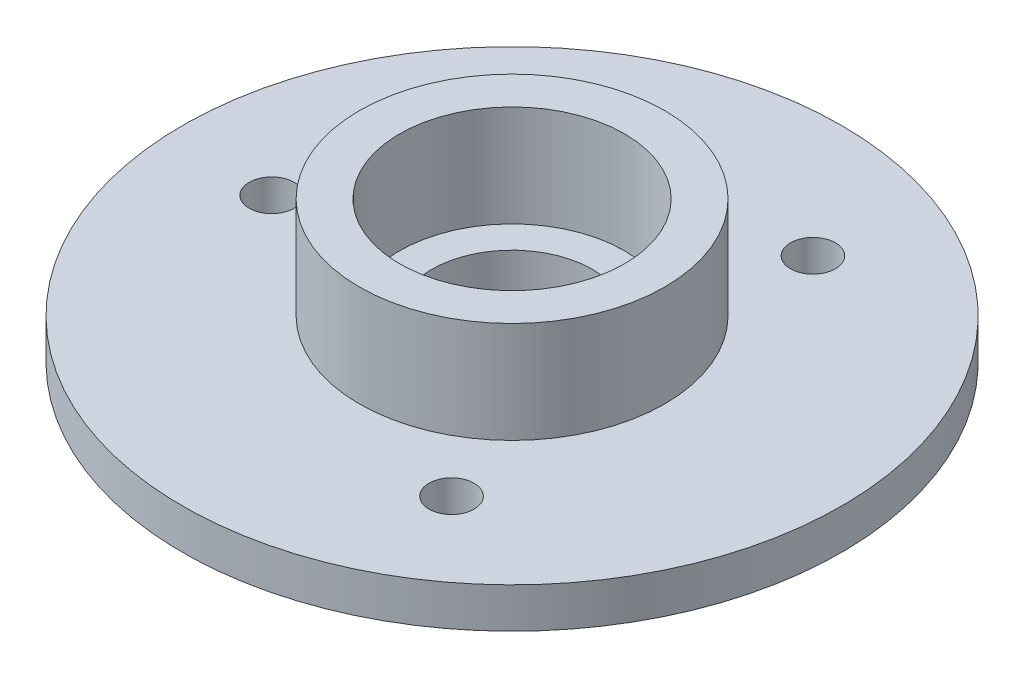
ISO-10303-21;
HEADER;
FILE_DESCRIPTION(('STEP AP214'),'2;1');
FILE_NAME('part.step','',(''),(''),'','','');
FILE_SCHEMA(('AUTOMOTIVE_DESIGN { 1 0 10303 214 1 1 1 1 }'));
ENDSEC;
DATA;
#1=APPLICATION_CONTEXT('core data for automotive mechanical design processes');
#2=APPLICATION_PROTOCOL_DEFINITION('international standard','automotive_design',2000,#1);
#3=PRODUCT_CONTEXT('',#1,'mechanical');
#4=PRODUCT('Part','Part','',(#3));
#5=PRODUCT_RELATED_PRODUCT_CATEGORY('part','',(#4));
#6=PRODUCT_DEFINITION_FORMATION('','',#4);
#7=PRODUCT_DEFINITION_CONTEXT('part definition',#1,'design');
#8=PRODUCT_DEFINITION('design','',#6,#7);
#9=PRODUCT_DEFINITION_SHAPE('','',#8);
#10=(LENGTH_UNIT() NAMED_UNIT(*) SI_UNIT(.MILLI.,.METRE.));
#11=(NAMED_UNIT(*) PLANE_ANGLE_UNIT() SI_UNIT($,.RADIAN.));
#12=(NAMED_UNIT(*) SI_UNIT($,.STERADIAN.) SOLID_ANGLE_UNIT());
#13=UNCERTAINTY_MEASURE_WITH_UNIT(LENGTH_MEASURE(1.E-05),#10,'distance_accuracy_value','');
#14=(GEOMETRIC_REPRESENTATION_CONTEXT(3) GLOBAL_UNCERTAINTY_ASSIGNED_CONTEXT((#13)) GLOBAL_UNIT_ASSIGNED_CONTEXT((#10,
#11,#12)) REPRESENTATION_CONTEXT('',''));
#15=CARTESIAN_POINT('',(0.,0.,0.));
#16=DIRECTION('',(0.,0.,1.));
#17=DIRECTION('',(1.,0.,0.));
#18=AXIS2_PLACEMENT_3D('',#15,#16,#17);
#19=CARTESIAN_POINT('',(0.,0.,0.));
#20=DIRECTION('',(0.,-1.,0.));
#21=DIRECTION('',(0.,0.,-1.));
#22=AXIS2_PLACEMENT_3D('',#19,#20,#21);
#23=CYLINDRICAL_SURFACE('',#22,7.);
#24=CARTESIAN_POINT('',(0.,8.8,0.));
#25=DIRECTION('',(0.,-1.,0.));
#26=DIRECTION('',(0.,0.,-1.));
#27=AXIS2_PLACEMENT_3D('',#24,#25,#26);
#28=CIRCLE('',#27,7.);
#29=CARTESIAN_POINT('',(0.,8.8,-7.));
#30=VERTEX_POINT('',#29);
#31=EDGE_CURVE('E52',#30,#30,#28,.T.);
#32=ORIENTED_EDGE('',*,*,#31,.F.);
#33=EDGE_LOOP('',(#32));
#34=FACE_BOUND('',#33,.T.);
#35=CARTESIAN_POINT('',(0.,2.5,0.));
#36=DIRECTION('',(0.,-1.,0.));
#37=DIRECTION('',(0.,0.,-1.));
#38=AXIS2_PLACEMENT_3D('',#35,#36,#37);
#39=CIRCLE('',#38,7.);
#40=CARTESIAN_POINT('',(0.,2.5,-7.));
#41=VERTEX_POINT('',#40);
#42=EDGE_CURVE('E10',#41,#41,#39,.T.);
#43=ORIENTED_EDGE('',*,*,#42,.T.);
#44=EDGE_LOOP('',(#43));
#45=FACE_BOUND('',#44,.T.);
#46=ADVANCED_FACE('F34',(#34,#45),#23,.F.);
#47=CARTESIAN_POINT('',(11.983044143389,2.5,0.));
#48=DIRECTION('',(0.,-1.,0.));
#49=DIRECTION('',(0.,0.,-1.));
#50=AXIS2_PLACEMENT_3D('',#47,#48,#49);
#51=PLANE('',#50);
#52=ORIENTED_EDGE('',*,*,#42,.F.);
#53=EDGE_LOOP('',(#52));
#54=FACE_BOUND('',#53,.T.);
#55=CARTESIAN_POINT('',(0.,2.5,0.));
#56=DIRECTION('',(0.,-1.,0.));
#57=DIRECTION('',(0.,0.,-1.));
#58=AXIS2_PLACEMENT_3D('',#55,#56,#57);
#59=CIRCLE('',#58,5.);
#60=CARTESIAN_POINT('',(0.,2.5,-5.));
#61=VERTEX_POINT('',#60);
#62=EDGE_CURVE('E41',#61,#61,#59,.T.);
#63=ORIENTED_EDGE('',*,*,#62,.T.);
#64=EDGE_LOOP('',(#63));
#65=FACE_BOUND('',#64,.T.);
#66=ADVANCED_FACE('F99',(#54,#65),#51,.F.);
#67=CARTESIAN_POINT('',(0.,0.,0.));
#68=DIRECTION('',(0.,-1.,0.));
#69=DIRECTION('',(0.,0.,-1.));
#70=AXIS2_PLACEMENT_3D('',#67,#68,#69);
#71=CYLINDRICAL_SURFACE('',#70,5.);
#72=ORIENTED_EDGE('',*,*,#62,.F.);
#73=EDGE_LOOP('',(#72));
#74=FACE_BOUND('',#73,.T.);
#75=CARTESIAN_POINT('',(0.,0.,0.));
#76=DIRECTION('',(0.,-1.,0.));
#77=DIRECTION('',(0.,0.,-1.));
#78=AXIS2_PLACEMENT_3D('',#75,#76,#77);
#79=CIRCLE('',#78,5.);
#80=CARTESIAN_POINT('',(0.,0.,-5.));
#81=VERTEX_POINT('',#80);
#82=EDGE_CURVE('E46',#81,#81,#79,.T.);
#83=ORIENTED_EDGE('',*,*,#82,.T.);
#84=EDGE_LOOP('',(#83));
#85=FACE_BOUND('',#84,.T.);
#86=ADVANCED_FACE('F85',(#74,#85),#71,.F.);
#87=CARTESIAN_POINT('',(11.983044143389,0.,0.));
#88=DIRECTION('',(0.,-1.,0.));
#89=DIRECTION('',(0.,0.,-1.));
#90=AXIS2_PLACEMENT_3D('',#87,#88,#89);
#91=PLANE('',#90);
#92=CARTESIAN_POINT('',(6.1285660781205,0.,-12.5873221070294));
#93=DIRECTION('',(0.,-1.,0.));
#94=DIRECTION('',(0.,0.,-1.));
#95=AXIS2_PLACEMENT_3D('',#92,#93,#94);
#96=CIRCLE('',#95,1.4);
#97=CARTESIAN_POINT('',(6.1285660781205,0.,-13.9873221070294));
#98=VERTEX_POINT('',#97);
#99=EDGE_CURVE('E66',#98,#98,#96,.T.);
#100=ORIENTED_EDGE('',*,*,#99,.F.);
#101=EDGE_LOOP('',(#100));
#102=FACE_BOUND('',#101,.T.);
#103=CARTESIAN_POINT('',(7.83665767124466,0.,11.6011549659386));
#104=DIRECTION('',(0.,-1.,0.));
#105=DIRECTION('',(0.,0.,-1.));
#106=AXIS2_PLACEMENT_3D('',#103,#104,#105);
#107=CIRCLE('',#106,1.4);
#108=CARTESIAN_POINT('',(7.83665767124466,0.,10.2011549659386));
#109=VERTEX_POINT('',#108);
#110=EDGE_CURVE('E56',#109,#109,#107,.T.);
#111=ORIENTED_EDGE('',*,*,#110,.F.);
#112=EDGE_LOOP('',(#111));
#113=FACE_BOUND('',#112,.T.);
#114=CARTESIAN_POINT('',(-13.9652237493652,0.,0.986167141090767));
#115=DIRECTION('',(0.,-1.,0.));
#116=DIRECTION('',(0.,0.,-1.));
#117=AXIS2_PLACEMENT_3D('',#114,#115,#116);
#118=CIRCLE('',#117,1.4);
#119=CARTESIAN_POINT('',(-13.9652237493652,0.,-0.413832858909236));
#120=VERTEX_POINT('',#119);
#121=EDGE_CURVE('E53',#120,#120,#118,.T.);
#122=ORIENTED_EDGE('',*,*,#121,.F.);
#123=EDGE_LOOP('',(#122));
#124=FACE_BOUND('',#123,.T.);
#125=CARTESIAN_POINT('',(0.,0.,0.));
#126=DIRECTION('',(0.,-1.,0.));
#127=DIRECTION('',(0.,0.,-1.));
#128=AXIS2_PLACEMENT_3D('',#125,#126,#127);
#129=CIRCLE('',#128,20.5);
#130=CARTESIAN_POINT('',(0.,0.,-20.5));
#131=VERTEX_POINT('',#130);
#132=EDGE_CURVE('E80',#131,#131,#129,.T.);
#133=ORIENTED_EDGE('',*,*,#132,.T.);
#134=EDGE_LOOP('',(#133));
#135=FACE_BOUND('',#134,.T.);
#136=ORIENTED_EDGE('',*,*,#82,.F.);
#137=EDGE_LOOP('',(#136));
#138=FACE_BOUND('',#137,.T.);
#139=ADVANCED_FACE('F87',(#102,#113,#124,#135,#138),#91,.T.);
#140=CARTESIAN_POINT('',(0.,0.,0.));
#141=DIRECTION('',(0.,-1.,0.));
#142=DIRECTION('',(0.,0.,-1.));
#143=AXIS2_PLACEMENT_3D('',#140,#141,#142);
#144=CYLINDRICAL_SURFACE('',#143,20.5);
#145=CARTESIAN_POINT('',(0.,2.5,0.));
#146=DIRECTION('',(0.,-1.,0.));
#147=DIRECTION('',(0.,0.,-1.));
#148=AXIS2_PLACEMENT_3D('',#145,#146,#147);
#149=CIRCLE('',#148,20.5);
#150=CARTESIAN_POINT('',(0.,2.5,-20.5));
#151=VERTEX_POINT('',#150);
#152=EDGE_CURVE('E77',#151,#151,#149,.T.);
#153=ORIENTED_EDGE('',*,*,#152,.T.);
#154=EDGE_LOOP('',(#153));
#155=FACE_BOUND('',#154,.T.);
#156=ORIENTED_EDGE('',*,*,#132,.F.);
#157=EDGE_LOOP('',(#156));
#158=FACE_BOUND('',#157,.T.);
#159=ADVANCED_FACE('F89',(#155,#158),#144,.T.);
#160=CARTESIAN_POINT('',(6.1285660781205,2.5,-12.5873221070294));
#161=DIRECTION('',(0.,-1.,0.));
#162=DIRECTION('',(0.,0.,-1.));
#163=AXIS2_PLACEMENT_3D('',#160,#161,#162);
#164=CIRCLE('',#163,1.4);
#165=CARTESIAN_POINT('',(6.1285660781205,2.5,-13.9873221070294));
#166=VERTEX_POINT('',#165);
#167=EDGE_CURVE('E37',#166,#166,#164,.T.);
#168=ORIENTED_EDGE('',*,*,#167,.T.);
#169=EDGE_LOOP('',(#168));
#170=FACE_BOUND('',#169,.T.);
#171=CARTESIAN_POINT('',(7.83665767124466,2.5,11.6011549659386));
#172=DIRECTION('',(0.,-1.,0.));
#173=DIRECTION('',(0.,0.,-1.));
#174=AXIS2_PLACEMENT_3D('',#171,#172,#173);
#175=CIRCLE('',#174,1.4);
#176=CARTESIAN_POINT('',(7.83665767124466,2.5,10.2011549659386));
#177=VERTEX_POINT('',#176);
#178=EDGE_CURVE('E54',#177,#177,#175,.T.);
#179=ORIENTED_EDGE('',*,*,#178,.T.);
#180=EDGE_LOOP('',(#179));
#181=FACE_BOUND('',#180,.T.);
#182=CARTESIAN_POINT('',(-13.9652237493652,2.5,0.986167141090767));
#183=DIRECTION('',(0.,-1.,0.));
#184=DIRECTION('',(0.,0.,-1.));
#185=AXIS2_PLACEMENT_3D('',#182,#183,#184);
#186=CIRCLE('',#185,1.4);
#187=CARTESIAN_POINT('',(-13.9652237493652,2.5,-0.413832858909236));
#188=VERTEX_POINT('',#187);
#189=EDGE_CURVE('E50',#188,#188,#186,.T.);
#190=ORIENTED_EDGE('',*,*,#189,.T.);
#191=EDGE_LOOP('',(#190));
#192=FACE_BOUND('',#191,.T.);
#193=ORIENTED_EDGE('',*,*,#152,.F.);
#194=EDGE_LOOP('',(#193));
#195=FACE_BOUND('',#194,.T.);
#196=CARTESIAN_POINT('',(0.,2.5,0.));
#197=DIRECTION('',(0.,-1.,0.));
#198=DIRECTION('',(0.,0.,-1.));
#199=AXIS2_PLACEMENT_3D('',#196,#197,#198);
#200=CIRCLE('',#199,9.5);
#201=CARTESIAN_POINT('',(0.,2.5,-9.5));
#202=VERTEX_POINT('',#201);
#203=EDGE_CURVE('E74',#202,#202,#200,.T.);
#204=ORIENTED_EDGE('',*,*,#203,.T.);
#205=EDGE_LOOP('',(#204));
#206=FACE_BOUND('',#205,.T.);
#207=ADVANCED_FACE('F96',(#170,#181,#192,#195,#206),#51,.F.);
#208=CARTESIAN_POINT('',(0.,0.,0.));
#209=DIRECTION('',(0.,-1.,0.));
#210=DIRECTION('',(0.,0.,-1.));
#211=AXIS2_PLACEMENT_3D('',#208,#209,#210);
#212=CYLINDRICAL_SURFACE('',#211,9.5);
#213=CARTESIAN_POINT('',(0.,8.8,0.));
#214=DIRECTION('',(0.,-1.,0.));
#215=DIRECTION('',(0.,0.,-1.));
#216=AXIS2_PLACEMENT_3D('',#213,#214,#215);
#217=CIRCLE('',#216,9.5);
#218=CARTESIAN_POINT('',(0.,8.8,-9.5));
#219=VERTEX_POINT('',#218);
#220=EDGE_CURVE('E71',#219,#219,#217,.T.);
#221=ORIENTED_EDGE('',*,*,#220,.T.);
#222=EDGE_LOOP('',(#221));
#223=FACE_BOUND('',#222,.T.);
#224=ORIENTED_EDGE('',*,*,#203,.F.);
#225=EDGE_LOOP('',(#224));
#226=FACE_BOUND('',#225,.T.);
#227=ADVANCED_FACE('F116',(#223,#226),#212,.T.);
#228=CARTESIAN_POINT('',(11.983044143389,8.8,0.));
#229=DIRECTION('',(0.,1.,0.));
#230=DIRECTION('',(0.,0.,1.));
#231=AXIS2_PLACEMENT_3D('',#228,#229,#230);
#232=PLANE('',#231);
#233=ORIENTED_EDGE('',*,*,#31,.T.);
#234=EDGE_LOOP('',(#233));
#235=FACE_BOUND('',#234,.T.);
#236=ORIENTED_EDGE('',*,*,#220,.F.);
#237=EDGE_LOOP('',(#236));
#238=FACE_BOUND('',#237,.T.);
#239=ADVANCED_FACE('F112',(#235,#238),#232,.T.);
#240=CARTESIAN_POINT('',(-13.9652237493652,10.,0.986167141090767));
#241=DIRECTION('',(0.,-1.,0.));
#242=DIRECTION('',(0.,0.,-1.));
#243=AXIS2_PLACEMENT_3D('',#240,#241,#242);
#244=CYLINDRICAL_SURFACE('',#243,1.4);
#245=ORIENTED_EDGE('',*,*,#121,.T.);
#246=EDGE_LOOP('',(#245));
#247=FACE_BOUND('',#246,.T.);
#248=ORIENTED_EDGE('',*,*,#189,.F.);
#249=EDGE_LOOP('',(#248));
#250=FACE_BOUND('',#249,.T.);
#251=ADVANCED_FACE('F115',(#247,#250),#244,.F.);
#252=CARTESIAN_POINT('',(7.83665767124466,10.,11.6011549659386));
#253=DIRECTION('',(0.,-1.,0.));
#254=DIRECTION('',(0.,0.,-1.));
#255=AXIS2_PLACEMENT_3D('',#252,#253,#254);
#256=CYLINDRICAL_SURFACE('',#255,1.4);
#257=ORIENTED_EDGE('',*,*,#110,.T.);
#258=EDGE_LOOP('',(#257));
#259=FACE_BOUND('',#258,.T.);
#260=ORIENTED_EDGE('',*,*,#178,.F.);
#261=EDGE_LOOP('',(#260));
#262=FACE_BOUND('',#261,.T.);
#263=ADVANCED_FACE('F132',(#259,#262),#256,.F.);
#264=CARTESIAN_POINT('',(6.1285660781205,10.,-12.5873221070294));
#265=DIRECTION('',(0.,-1.,0.));
#266=DIRECTION('',(0.,0.,-1.));
#267=AXIS2_PLACEMENT_3D('',#264,#265,#266);
#268=CYLINDRICAL_SURFACE('',#267,1.4);
#269=ORIENTED_EDGE('',*,*,#99,.T.);
#270=EDGE_LOOP('',(#269));
#271=FACE_BOUND('',#270,.T.);
#272=ORIENTED_EDGE('',*,*,#167,.F.);
#273=EDGE_LOOP('',(#272));
#274=FACE_BOUND('',#273,.T.);
#275=ADVANCED_FACE('F136',(#271,#274),#268,.F.);
#276=CLOSED_SHELL('',(#46,#66,#86,#139,#159,#207,#227,#239,#251,#263,#275));
#277=MANIFOLD_SOLID_BREP('B2',#276);
#278=ADVANCED_BREP_SHAPE_REPRESENTATION('',(#18,#277),#14);
#279=SHAPE_DEFINITION_REPRESENTATION(#9,#278);
ENDSEC;
END-ISO-10303-21;
